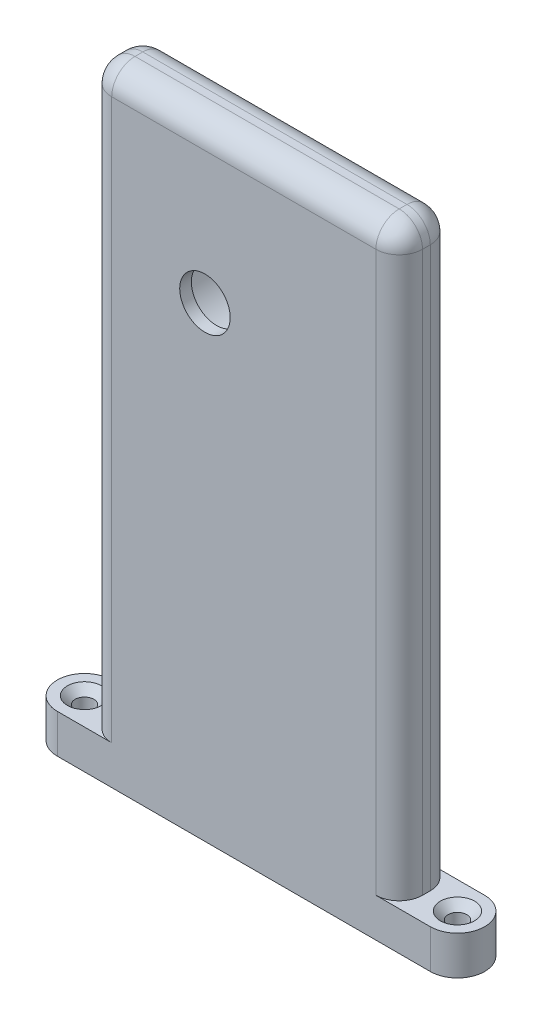
ISO-10303-21;
HEADER;
FILE_DESCRIPTION(('STEP AP214'),'2;1');
FILE_NAME('part.step','',(''),(''),'','','');
FILE_SCHEMA(('AUTOMOTIVE_DESIGN { 1 0 10303 214 1 1 1 1 }'));
ENDSEC;
DATA;
#1=APPLICATION_CONTEXT('core data for automotive mechanical design processes');
#2=APPLICATION_PROTOCOL_DEFINITION('international standard','automotive_design',2000,#1);
#3=PRODUCT_CONTEXT('',#1,'mechanical');
#4=PRODUCT('Part','Part','',(#3));
#5=PRODUCT_RELATED_PRODUCT_CATEGORY('part','',(#4));
#6=PRODUCT_DEFINITION_FORMATION('','',#4);
#7=PRODUCT_DEFINITION_CONTEXT('part definition',#1,'design');
#8=PRODUCT_DEFINITION('design','',#6,#7);
#9=PRODUCT_DEFINITION_SHAPE('','',#8);
#10=(LENGTH_UNIT() NAMED_UNIT(*) SI_UNIT(.MILLI.,.METRE.));
#11=(NAMED_UNIT(*) PLANE_ANGLE_UNIT() SI_UNIT($,.RADIAN.));
#12=(NAMED_UNIT(*) SI_UNIT($,.STERADIAN.) SOLID_ANGLE_UNIT());
#13=UNCERTAINTY_MEASURE_WITH_UNIT(LENGTH_MEASURE(1.E-05),#10,'distance_accuracy_value','');
#14=(GEOMETRIC_REPRESENTATION_CONTEXT(3) GLOBAL_UNCERTAINTY_ASSIGNED_CONTEXT((#13)) GLOBAL_UNIT_ASSIGNED_CONTEXT((#10,
#11,#12)) REPRESENTATION_CONTEXT('',''));
#15=CARTESIAN_POINT('',(0.,0.,0.));
#16=DIRECTION('',(0.,0.,1.));
#17=DIRECTION('',(1.,0.,0.));
#18=AXIS2_PLACEMENT_3D('',#15,#16,#17);
#19=CARTESIAN_POINT('',(20.,0.,7.));
#20=DIRECTION('',(-1.,0.,0.));
#21=DIRECTION('',(0.,0.,1.));
#22=AXIS2_PLACEMENT_3D('',#19,#20,#21);
#23=PLANE('',#22);
#24=DIRECTION('',(0.,0.,1.));
#25=VECTOR('',#24,1.);
#26=CARTESIAN_POINT('',(20.,-35.,7.));
#27=LINE('',#26,#25);
#28=CARTESIAN_POINT('',(20.,-35.,3.));
#29=VERTEX_POINT('',#28);
#30=CARTESIAN_POINT('',(20.,-35.,4.));
#31=VERTEX_POINT('',#30);
#32=EDGE_CURVE('E283',#29,#31,#27,.T.);
#33=ORIENTED_EDGE('',*,*,#32,.F.);
#34=DIRECTION('',(0.,1.,0.));
#35=VECTOR('',#34,1.);
#36=CARTESIAN_POINT('',(20.,0.,3.));
#37=LINE('',#36,#35);
#38=CARTESIAN_POINT('',(20.,37.,3.));
#39=VERTEX_POINT('',#38);
#40=EDGE_CURVE('E185',#29,#39,#37,.T.);
#41=ORIENTED_EDGE('',*,*,#40,.T.);
#42=DIRECTION('',(0.,0.,-1.));
#43=VECTOR('',#42,1.);
#44=CARTESIAN_POINT('',(20.,37.,7.));
#45=LINE('',#44,#43);
#46=CARTESIAN_POINT('',(20.,37.,4.));
#47=VERTEX_POINT('',#46);
#48=EDGE_CURVE('E274',#39,#47,#45,.F.);
#49=ORIENTED_EDGE('',*,*,#48,.T.);
#50=DIRECTION('',(0.,1.,0.));
#51=VECTOR('',#50,1.);
#52=CARTESIAN_POINT('',(20.,-40.,4.));
#53=LINE('',#52,#51);
#54=EDGE_CURVE('E280',#47,#31,#53,.F.);
#55=ORIENTED_EDGE('',*,*,#54,.T.);
#56=EDGE_LOOP('',(#33,#41,#49,#55));
#57=FACE_BOUND('',#56,.T.);
#58=ADVANCED_FACE('F50',(#57),#23,.F.);
#59=CARTESIAN_POINT('',(-20.,0.,7.));
#60=DIRECTION('',(-1.,0.,0.));
#61=DIRECTION('',(0.,0.,1.));
#62=AXIS2_PLACEMENT_3D('',#59,#60,#61);
#63=PLANE('',#62);
#64=DIRECTION('',(0.,1.,0.));
#65=VECTOR('',#64,1.);
#66=CARTESIAN_POINT('',(-20.,-40.,3.));
#67=LINE('',#66,#65);
#68=CARTESIAN_POINT('',(-20.,37.,3.));
#69=VERTEX_POINT('',#68);
#70=CARTESIAN_POINT('',(-20.,-35.,3.));
#71=VERTEX_POINT('',#70);
#72=EDGE_CURVE('E189',#69,#71,#67,.F.);
#73=ORIENTED_EDGE('',*,*,#72,.T.);
#74=DIRECTION('',(0.,0.,1.));
#75=VECTOR('',#74,1.);
#76=CARTESIAN_POINT('',(-20.,-35.,7.));
#77=LINE('',#76,#75);
#78=CARTESIAN_POINT('',(-20.,-35.,4.));
#79=VERTEX_POINT('',#78);
#80=EDGE_CURVE('E62',#71,#79,#77,.T.);
#81=ORIENTED_EDGE('',*,*,#80,.T.);
#82=DIRECTION('',(0.,1.,0.));
#83=VECTOR('',#82,1.);
#84=CARTESIAN_POINT('',(-20.,0.,4.));
#85=LINE('',#84,#83);
#86=CARTESIAN_POINT('',(-20.,37.,4.));
#87=VERTEX_POINT('',#86);
#88=EDGE_CURVE('E170',#79,#87,#85,.T.);
#89=ORIENTED_EDGE('',*,*,#88,.T.);
#90=DIRECTION('',(0.,0.,-1.));
#91=VECTOR('',#90,1.);
#92=CARTESIAN_POINT('',(-20.,37.,7.));
#93=LINE('',#92,#91);
#94=EDGE_CURVE('E179',#87,#69,#93,.T.);
#95=ORIENTED_EDGE('',*,*,#94,.T.);
#96=EDGE_LOOP('',(#73,#81,#89,#95));
#97=FACE_BOUND('',#96,.T.);
#98=ADVANCED_FACE('F377',(#97),#63,.T.);
#99=CARTESIAN_POINT('',(-17.,0.,4.));
#100=DIRECTION('',(0.,1.,0.));
#101=DIRECTION('',(0.,0.,1.));
#102=AXIS2_PLACEMENT_3D('',#99,#100,#101);
#103=CYLINDRICAL_SURFACE('',#102,3.);
#104=ORIENTED_EDGE('',*,*,#88,.F.);
#105=CARTESIAN_POINT('',(-17.,-35.,4.));
#106=DIRECTION('',(0.,-1.,0.));
#107=DIRECTION('',(0.,0.,-1.));
#108=AXIS2_PLACEMENT_3D('',#105,#106,#107);
#109=CIRCLE('',#108,3.);
#110=CARTESIAN_POINT('',(-17.,-35.,7.));
#111=VERTEX_POINT('',#110);
#112=EDGE_CURVE('E151',#79,#111,#109,.F.);
#113=ORIENTED_EDGE('',*,*,#112,.T.);
#114=DIRECTION('',(0.,1.,0.));
#115=VECTOR('',#114,1.);
#116=CARTESIAN_POINT('',(-17.,0.,7.));
#117=LINE('',#116,#115);
#118=CARTESIAN_POINT('',(-17.,37.,7.));
#119=VERTEX_POINT('',#118);
#120=EDGE_CURVE('E164',#119,#111,#117,.F.);
#121=ORIENTED_EDGE('',*,*,#120,.F.);
#122=CARTESIAN_POINT('',(-17.,37.,4.));
#123=DIRECTION('',(0.,1.,0.));
#124=DIRECTION('',(0.,0.,1.));
#125=AXIS2_PLACEMENT_3D('',#122,#123,#124);
#126=CIRCLE('',#125,3.);
#127=EDGE_CURVE('E233',#87,#119,#126,.T.);
#128=ORIENTED_EDGE('',*,*,#127,.F.);
#129=EDGE_LOOP('',(#104,#113,#121,#128));
#130=FACE_BOUND('',#129,.T.);
#131=ADVANCED_FACE('F47',(#130),#103,.T.);
#132=CARTESIAN_POINT('',(17.,0.,4.));
#133=DIRECTION('',(0.,-1.,0.));
#134=DIRECTION('',(0.,0.,-1.));
#135=AXIS2_PLACEMENT_3D('',#132,#133,#134);
#136=CYLINDRICAL_SURFACE('',#135,3.);
#137=DIRECTION('',(0.,1.,0.));
#138=VECTOR('',#137,1.);
#139=CARTESIAN_POINT('',(17.,40.,7.));
#140=LINE('',#139,#138);
#141=CARTESIAN_POINT('',(17.,-35.,7.));
#142=VERTEX_POINT('',#141);
#143=CARTESIAN_POINT('',(17.,37.,7.));
#144=VERTEX_POINT('',#143);
#145=EDGE_CURVE('E176',#142,#144,#140,.T.);
#146=ORIENTED_EDGE('',*,*,#145,.F.);
#147=CARTESIAN_POINT('',(17.,-35.,4.));
#148=DIRECTION('',(0.,-1.,0.));
#149=DIRECTION('',(0.,0.,-1.));
#150=AXIS2_PLACEMENT_3D('',#147,#148,#149);
#151=CIRCLE('',#150,3.);
#152=EDGE_CURVE('E311',#142,#31,#151,.F.);
#153=ORIENTED_EDGE('',*,*,#152,.T.);
#154=ORIENTED_EDGE('',*,*,#54,.F.);
#155=CARTESIAN_POINT('',(17.,37.,4.));
#156=DIRECTION('',(0.,1.,0.));
#157=DIRECTION('',(0.,0.,1.));
#158=AXIS2_PLACEMENT_3D('',#155,#156,#157);
#159=CIRCLE('',#158,3.);
#160=EDGE_CURVE('E227',#144,#47,#159,.T.);
#161=ORIENTED_EDGE('',*,*,#160,.F.);
#162=EDGE_LOOP('',(#146,#153,#154,#161));
#163=FACE_BOUND('',#162,.T.);
#164=ADVANCED_FACE('F307',(#163),#136,.T.);
#165=CARTESIAN_POINT('',(-17.,0.,3.));
#166=DIRECTION('',(0.,-1.,0.));
#167=DIRECTION('',(0.,0.,-1.));
#168=AXIS2_PLACEMENT_3D('',#165,#166,#167);
#169=CYLINDRICAL_SURFACE('',#168,3.);
#170=DIRECTION('',(0.,1.,0.));
#171=VECTOR('',#170,1.);
#172=CARTESIAN_POINT('',(-17.,40.,0.));
#173=LINE('',#172,#171);
#174=CARTESIAN_POINT('',(-17.,-35.,0.));
#175=VERTEX_POINT('',#174);
#176=CARTESIAN_POINT('',(-17.,37.,0.));
#177=VERTEX_POINT('',#176);
#178=EDGE_CURVE('E261',#175,#177,#173,.T.);
#179=ORIENTED_EDGE('',*,*,#178,.F.);
#180=CARTESIAN_POINT('',(-17.,-35.,3.));
#181=DIRECTION('',(0.,-1.,0.));
#182=DIRECTION('',(0.,0.,-1.));
#183=AXIS2_PLACEMENT_3D('',#180,#181,#182);
#184=CIRCLE('',#183,3.);
#185=EDGE_CURVE('E11',#175,#71,#184,.F.);
#186=ORIENTED_EDGE('',*,*,#185,.T.);
#187=ORIENTED_EDGE('',*,*,#72,.F.);
#188=CARTESIAN_POINT('',(-17.,37.,3.));
#189=DIRECTION('',(0.,1.,0.));
#190=DIRECTION('',(0.,0.,1.));
#191=AXIS2_PLACEMENT_3D('',#188,#189,#190);
#192=CIRCLE('',#191,3.);
#193=EDGE_CURVE('E210',#177,#69,#192,.T.);
#194=ORIENTED_EDGE('',*,*,#193,.F.);
#195=EDGE_LOOP('',(#179,#186,#187,#194));
#196=FACE_BOUND('',#195,.T.);
#197=ADVANCED_FACE('F356',(#196),#169,.T.);
#198=CARTESIAN_POINT('',(17.,0.,3.));
#199=DIRECTION('',(0.,1.,0.));
#200=DIRECTION('',(0.,0.,1.));
#201=AXIS2_PLACEMENT_3D('',#198,#199,#200);
#202=CYLINDRICAL_SURFACE('',#201,3.);
#203=ORIENTED_EDGE('',*,*,#40,.F.);
#204=CARTESIAN_POINT('',(17.,-35.,3.));
#205=DIRECTION('',(0.,-1.,0.));
#206=DIRECTION('',(0.,0.,-1.));
#207=AXIS2_PLACEMENT_3D('',#204,#205,#206);
#208=CIRCLE('',#207,3.);
#209=CARTESIAN_POINT('',(17.,-35.,0.));
#210=VERTEX_POINT('',#209);
#211=EDGE_CURVE('E57',#29,#210,#208,.F.);
#212=ORIENTED_EDGE('',*,*,#211,.T.);
#213=DIRECTION('',(0.,1.,0.));
#214=VECTOR('',#213,1.);
#215=CARTESIAN_POINT('',(17.,0.,0.));
#216=LINE('',#215,#214);
#217=CARTESIAN_POINT('',(17.,37.,0.));
#218=VERTEX_POINT('',#217);
#219=EDGE_CURVE('E246',#218,#210,#216,.F.);
#220=ORIENTED_EDGE('',*,*,#219,.F.);
#221=CARTESIAN_POINT('',(17.,37.,3.));
#222=DIRECTION('',(0.,1.,0.));
#223=DIRECTION('',(0.,0.,1.));
#224=AXIS2_PLACEMENT_3D('',#221,#222,#223);
#225=CIRCLE('',#224,3.);
#226=EDGE_CURVE('E201',#39,#218,#225,.T.);
#227=ORIENTED_EDGE('',*,*,#226,.F.);
#228=EDGE_LOOP('',(#203,#212,#220,#227));
#229=FACE_BOUND('',#228,.T.);
#230=ADVANCED_FACE('F242',(#229),#202,.T.);
#231=CARTESIAN_POINT('',(-5.,20.,7.));
#232=DIRECTION('',(0.,0.,-1.));
#233=DIRECTION('',(-1.,0.,0.));
#234=AXIS2_PLACEMENT_3D('',#231,#232,#233);
#235=CYLINDRICAL_SURFACE('',#234,3.25);
#236=CARTESIAN_POINT('',(-5.,20.,7.));
#237=DIRECTION('',(0.,0.,1.));
#238=DIRECTION('',(1.,0.,0.));
#239=AXIS2_PLACEMENT_3D('',#236,#237,#238);
#240=CIRCLE('',#239,3.25);
#241=CARTESIAN_POINT('',(-1.75,20.,7.));
#242=VERTEX_POINT('',#241);
#243=EDGE_CURVE('E338',#242,#242,#240,.T.);
#244=ORIENTED_EDGE('',*,*,#243,.T.);
#245=EDGE_LOOP('',(#244));
#246=FACE_BOUND('',#245,.T.);
#247=CARTESIAN_POINT('',(-5.,20.,5.5));
#248=DIRECTION('',(0.,0.,-1.));
#249=DIRECTION('',(-1.,0.,0.));
#250=AXIS2_PLACEMENT_3D('',#247,#248,#249);
#251=CIRCLE('',#250,3.25);
#252=CARTESIAN_POINT('',(-8.25,20.,5.5));
#253=VERTEX_POINT('',#252);
#254=EDGE_CURVE('E330',#253,#253,#251,.T.);
#255=ORIENTED_EDGE('',*,*,#254,.T.);
#256=EDGE_LOOP('',(#255));
#257=FACE_BOUND('',#256,.T.);
#258=ADVANCED_FACE('F391',(#246,#257),#235,.F.);
#259=CARTESIAN_POINT('',(0.,-40.,7.));
#260=DIRECTION('',(0.,1.,0.));
#261=DIRECTION('',(0.,0.,1.));
#262=AXIS2_PLACEMENT_3D('',#259,#260,#261);
#263=PLANE('',#262);
#264=CARTESIAN_POINT('',(24.,-40.,3.5));
#265=DIRECTION('',(0.,-1.,0.));
#266=DIRECTION('',(0.,0.,-1.));
#267=AXIS2_PLACEMENT_3D('',#264,#265,#266);
#268=CIRCLE('',#267,1.2);
#269=CARTESIAN_POINT('',(24.,-40.,2.3));
#270=VERTEX_POINT('',#269);
#271=EDGE_CURVE('E669',#270,#270,#268,.T.);
#272=ORIENTED_EDGE('',*,*,#271,.F.);
#273=EDGE_LOOP('',(#272));
#274=FACE_BOUND('',#273,.T.);
#275=CARTESIAN_POINT('',(-24.,-40.,3.5));
#276=DIRECTION('',(0.,-1.,0.));
#277=DIRECTION('',(0.,0.,-1.));
#278=AXIS2_PLACEMENT_3D('',#275,#276,#277);
#279=CIRCLE('',#278,1.2);
#280=CARTESIAN_POINT('',(-24.,-40.,2.3));
#281=VERTEX_POINT('',#280);
#282=EDGE_CURVE('E727',#281,#281,#279,.T.);
#283=ORIENTED_EDGE('',*,*,#282,.F.);
#284=EDGE_LOOP('',(#283));
#285=FACE_BOUND('',#284,.T.);
#286=CARTESIAN_POINT('',(-24.,-40.,3.5));
#287=DIRECTION('',(0.,-1.,0.));
#288=DIRECTION('',(0.,0.,-1.));
#289=AXIS2_PLACEMENT_3D('',#286,#287,#288);
#290=CIRCLE('',#289,3.5);
#291=CARTESIAN_POINT('',(-24.,-40.,7.));
#292=VERTEX_POINT('',#291);
#293=CARTESIAN_POINT('',(-24.,-40.,0.));
#294=VERTEX_POINT('',#293);
#295=EDGE_CURVE('E157',#292,#294,#290,.T.);
#296=ORIENTED_EDGE('',*,*,#295,.T.);
#297=DIRECTION('',(1.,0.,0.));
#298=VECTOR('',#297,1.);
#299=CARTESIAN_POINT('',(0.,-40.,0.));
#300=LINE('',#299,#298);
#301=CARTESIAN_POINT('',(24.,-40.,0.));
#302=VERTEX_POINT('',#301);
#303=EDGE_CURVE('E334',#294,#302,#300,.T.);
#304=ORIENTED_EDGE('',*,*,#303,.T.);
#305=CARTESIAN_POINT('',(24.,-40.,3.5));
#306=DIRECTION('',(0.,-1.,0.));
#307=DIRECTION('',(0.,0.,-1.));
#308=AXIS2_PLACEMENT_3D('',#305,#306,#307);
#309=CIRCLE('',#308,3.5);
#310=CARTESIAN_POINT('',(24.,-40.,7.));
#311=VERTEX_POINT('',#310);
#312=EDGE_CURVE('E697',#302,#311,#309,.T.);
#313=ORIENTED_EDGE('',*,*,#312,.T.);
#314=DIRECTION('',(1.,0.,0.));
#315=VECTOR('',#314,1.);
#316=CARTESIAN_POINT('',(0.,-40.,7.));
#317=LINE('',#316,#315);
#318=EDGE_CURVE('E343',#292,#311,#317,.T.);
#319=ORIENTED_EDGE('',*,*,#318,.F.);
#320=EDGE_LOOP('',(#296,#304,#313,#319));
#321=FACE_BOUND('',#320,.T.);
#322=ADVANCED_FACE('F387',(#274,#285,#321),#263,.F.);
#323=CARTESIAN_POINT('',(0.,40.,7.));
#324=DIRECTION('',(0.,1.,0.));
#325=DIRECTION('',(0.,0.,1.));
#326=AXIS2_PLACEMENT_3D('',#323,#324,#325);
#327=PLANE('',#326);
#328=DIRECTION('',(1.,0.,0.));
#329=VECTOR('',#328,1.);
#330=CARTESIAN_POINT('',(-20.,40.,3.));
#331=LINE('',#330,#329);
#332=CARTESIAN_POINT('',(17.,40.,3.));
#333=VERTEX_POINT('',#332);
#334=CARTESIAN_POINT('',(-17.,40.,3.));
#335=VERTEX_POINT('',#334);
#336=EDGE_CURVE('E270',#333,#335,#331,.F.);
#337=ORIENTED_EDGE('',*,*,#336,.T.);
#338=DIRECTION('',(0.,0.,-1.));
#339=VECTOR('',#338,1.);
#340=CARTESIAN_POINT('',(-17.,40.,7.));
#341=LINE('',#340,#339);
#342=CARTESIAN_POINT('',(-17.,40.,4.));
#343=VERTEX_POINT('',#342);
#344=EDGE_CURVE('E272',#335,#343,#341,.F.);
#345=ORIENTED_EDGE('',*,*,#344,.T.);
#346=DIRECTION('',(1.,0.,0.));
#347=VECTOR('',#346,1.);
#348=CARTESIAN_POINT('',(0.,40.,4.));
#349=LINE('',#348,#347);
#350=CARTESIAN_POINT('',(17.,40.,4.));
#351=VERTEX_POINT('',#350);
#352=EDGE_CURVE('E258',#343,#351,#349,.T.);
#353=ORIENTED_EDGE('',*,*,#352,.T.);
#354=DIRECTION('',(0.,0.,-1.));
#355=VECTOR('',#354,1.);
#356=CARTESIAN_POINT('',(17.,40.,0.));
#357=LINE('',#356,#355);
#358=EDGE_CURVE('E253',#351,#333,#357,.T.);
#359=ORIENTED_EDGE('',*,*,#358,.T.);
#360=EDGE_LOOP('',(#337,#345,#353,#359));
#361=FACE_BOUND('',#360,.T.);
#362=ADVANCED_FACE('F296',(#361),#327,.T.);
#363=CARTESIAN_POINT('',(0.,0.,7.));
#364=DIRECTION('',(0.,0.,1.));
#365=DIRECTION('',(1.,0.,0.));
#366=AXIS2_PLACEMENT_3D('',#363,#364,#365);
#367=PLANE('',#366);
#368=ORIENTED_EDGE('',*,*,#318,.T.);
#369=DIRECTION('',(0.,-1.,0.));
#370=VECTOR('',#369,1.);
#371=CARTESIAN_POINT('',(24.,-35.,7.));
#372=LINE('',#371,#370);
#373=CARTESIAN_POINT('',(24.,-35.,7.));
#374=VERTEX_POINT('',#373);
#375=EDGE_CURVE('E689',#374,#311,#372,.T.);
#376=ORIENTED_EDGE('',*,*,#375,.F.);
#377=DIRECTION('',(-1.,0.,0.));
#378=VECTOR('',#377,1.);
#379=CARTESIAN_POINT('',(17.,-35.,7.));
#380=LINE('',#379,#378);
#381=EDGE_CURVE('E709',#374,#142,#380,.T.);
#382=ORIENTED_EDGE('',*,*,#381,.T.);
#383=ORIENTED_EDGE('',*,*,#145,.T.);
#384=DIRECTION('',(1.,0.,0.));
#385=VECTOR('',#384,1.);
#386=CARTESIAN_POINT('',(0.,37.,7.));
#387=LINE('',#386,#385);
#388=EDGE_CURVE('E172',#144,#119,#387,.F.);
#389=ORIENTED_EDGE('',*,*,#388,.T.);
#390=ORIENTED_EDGE('',*,*,#120,.T.);
#391=DIRECTION('',(-1.,0.,0.));
#392=VECTOR('',#391,1.);
#393=CARTESIAN_POINT('',(-17.,-35.,7.));
#394=LINE('',#393,#392);
#395=CARTESIAN_POINT('',(-24.,-35.,7.));
#396=VERTEX_POINT('',#395);
#397=EDGE_CURVE('E147',#111,#396,#394,.T.);
#398=ORIENTED_EDGE('',*,*,#397,.T.);
#399=DIRECTION('',(0.,-1.,0.));
#400=VECTOR('',#399,1.);
#401=CARTESIAN_POINT('',(-24.,-35.,7.));
#402=LINE('',#401,#400);
#403=EDGE_CURVE('E694',#396,#292,#402,.T.);
#404=ORIENTED_EDGE('',*,*,#403,.T.);
#405=EDGE_LOOP('',(#368,#376,#382,#383,#389,#390,#398,#404));
#406=FACE_BOUND('',#405,.T.);
#407=ORIENTED_EDGE('',*,*,#243,.F.);
#408=EDGE_LOOP('',(#407));
#409=FACE_BOUND('',#408,.T.);
#410=ADVANCED_FACE('F171',(#406,#409),#367,.T.);
#411=CARTESIAN_POINT('',(0.,0.,0.));
#412=DIRECTION('',(0.,0.,1.));
#413=DIRECTION('',(1.,0.,0.));
#414=AXIS2_PLACEMENT_3D('',#411,#412,#413);
#415=PLANE('',#414);
#416=CARTESIAN_POINT('',(-5.,20.,0.));
#417=DIRECTION('',(0.,0.,-1.));
#418=DIRECTION('',(-1.,0.,0.));
#419=AXIS2_PLACEMENT_3D('',#416,#417,#418);
#420=CIRCLE('',#419,6.5);
#421=CARTESIAN_POINT('',(-11.5,20.,0.));
#422=VERTEX_POINT('',#421);
#423=EDGE_CURVE('E337',#422,#422,#420,.T.);
#424=ORIENTED_EDGE('',*,*,#423,.F.);
#425=EDGE_LOOP('',(#424));
#426=FACE_BOUND('',#425,.T.);
#427=DIRECTION('',(1.,0.,0.));
#428=VECTOR('',#427,1.);
#429=CARTESIAN_POINT('',(20.,37.,0.));
#430=LINE('',#429,#428);
#431=EDGE_CURVE('E254',#177,#218,#430,.T.);
#432=ORIENTED_EDGE('',*,*,#431,.T.);
#433=ORIENTED_EDGE('',*,*,#219,.T.);
#434=DIRECTION('',(1.,0.,0.));
#435=VECTOR('',#434,1.);
#436=CARTESIAN_POINT('',(17.,-35.,0.));
#437=LINE('',#436,#435);
#438=CARTESIAN_POINT('',(24.,-35.,0.));
#439=VERTEX_POINT('',#438);
#440=EDGE_CURVE('E69',#210,#439,#437,.T.);
#441=ORIENTED_EDGE('',*,*,#440,.T.);
#442=DIRECTION('',(0.,-1.,0.));
#443=VECTOR('',#442,1.);
#444=CARTESIAN_POINT('',(24.,-35.,0.));
#445=LINE('',#444,#443);
#446=EDGE_CURVE('E704',#439,#302,#445,.T.);
#447=ORIENTED_EDGE('',*,*,#446,.T.);
#448=ORIENTED_EDGE('',*,*,#303,.F.);
#449=DIRECTION('',(0.,-1.,0.));
#450=VECTOR('',#449,1.);
#451=CARTESIAN_POINT('',(-24.,-35.,0.));
#452=LINE('',#451,#450);
#453=CARTESIAN_POINT('',(-24.,-35.,0.));
#454=VERTEX_POINT('',#453);
#455=EDGE_CURVE('E316',#454,#294,#452,.T.);
#456=ORIENTED_EDGE('',*,*,#455,.F.);
#457=DIRECTION('',(1.,0.,0.));
#458=VECTOR('',#457,1.);
#459=CARTESIAN_POINT('',(-17.,-35.,0.));
#460=LINE('',#459,#458);
#461=EDGE_CURVE('E354',#454,#175,#460,.T.);
#462=ORIENTED_EDGE('',*,*,#461,.T.);
#463=ORIENTED_EDGE('',*,*,#178,.T.);
#464=EDGE_LOOP('',(#432,#433,#441,#447,#448,#456,#462,#463));
#465=FACE_BOUND('',#464,.T.);
#466=ADVANCED_FACE('F249',(#426,#465),#415,.F.);
#467=CARTESIAN_POINT('',(-5.,20.,5.));
#468=DIRECTION('',(0.,0.,-1.));
#469=DIRECTION('',(-1.,0.,0.));
#470=AXIS2_PLACEMENT_3D('',#467,#468,#469);
#471=CYLINDRICAL_SURFACE('',#470,6.5);
#472=CARTESIAN_POINT('',(-5.,20.,5.));
#473=DIRECTION('',(0.,0.,-1.));
#474=DIRECTION('',(-1.,0.,0.));
#475=AXIS2_PLACEMENT_3D('',#472,#473,#474);
#476=CIRCLE('',#475,6.5);
#477=CARTESIAN_POINT('',(-11.5,20.,5.));
#478=VERTEX_POINT('',#477);
#479=EDGE_CURVE('E333',#478,#478,#476,.T.);
#480=ORIENTED_EDGE('',*,*,#479,.F.);
#481=EDGE_LOOP('',(#480));
#482=FACE_BOUND('',#481,.T.);
#483=ORIENTED_EDGE('',*,*,#423,.T.);
#484=EDGE_LOOP('',(#483));
#485=FACE_BOUND('',#484,.T.);
#486=ADVANCED_FACE('F505',(#482,#485),#471,.F.);
#487=CARTESIAN_POINT('',(-5.,20.,5.));
#488=DIRECTION('',(0.,0.,-1.));
#489=DIRECTION('',(-1.,0.,0.));
#490=AXIS2_PLACEMENT_3D('',#487,#488,#489);
#491=PLANE('',#490);
#492=CARTESIAN_POINT('',(-5.,20.,5.));
#493=DIRECTION('',(0.,0.,-1.));
#494=DIRECTION('',(-1.,0.,0.));
#495=AXIS2_PLACEMENT_3D('',#492,#493,#494);
#496=CIRCLE('',#495,6.);
#497=CARTESIAN_POINT('',(-11.,20.,5.));
#498=VERTEX_POINT('',#497);
#499=EDGE_CURVE('E238',#498,#498,#496,.T.);
#500=ORIENTED_EDGE('',*,*,#499,.F.);
#501=EDGE_LOOP('',(#500));
#502=FACE_BOUND('',#501,.T.);
#503=ORIENTED_EDGE('',*,*,#479,.T.);
#504=EDGE_LOOP('',(#503));
#505=FACE_BOUND('',#504,.T.);
#506=ADVANCED_FACE('F597',(#502,#505),#491,.T.);
#507=CARTESIAN_POINT('',(-5.,20.,5.5));
#508=DIRECTION('',(0.,0.,-1.));
#509=DIRECTION('',(-1.,0.,0.));
#510=AXIS2_PLACEMENT_3D('',#507,#508,#509);
#511=CYLINDRICAL_SURFACE('',#510,6.);
#512=CARTESIAN_POINT('',(-5.,20.,5.5));
#513=DIRECTION('',(0.,0.,-1.));
#514=DIRECTION('',(-1.,0.,0.));
#515=AXIS2_PLACEMENT_3D('',#512,#513,#514);
#516=CIRCLE('',#515,6.);
#517=CARTESIAN_POINT('',(-11.,20.,5.5));
#518=VERTEX_POINT('',#517);
#519=EDGE_CURVE('E322',#518,#518,#516,.T.);
#520=ORIENTED_EDGE('',*,*,#519,.F.);
#521=EDGE_LOOP('',(#520));
#522=FACE_BOUND('',#521,.T.);
#523=ORIENTED_EDGE('',*,*,#499,.T.);
#524=EDGE_LOOP('',(#523));
#525=FACE_BOUND('',#524,.T.);
#526=ADVANCED_FACE('F595',(#522,#525),#511,.F.);
#527=CARTESIAN_POINT('',(-5.,20.,5.5));
#528=DIRECTION('',(0.,0.,-1.));
#529=DIRECTION('',(-1.,0.,0.));
#530=AXIS2_PLACEMENT_3D('',#527,#528,#529);
#531=PLANE('',#530);
#532=ORIENTED_EDGE('',*,*,#254,.F.);
#533=EDGE_LOOP('',(#532));
#534=FACE_BOUND('',#533,.T.);
#535=ORIENTED_EDGE('',*,*,#519,.T.);
#536=EDGE_LOOP('',(#535));
#537=FACE_BOUND('',#536,.T.);
#538=ADVANCED_FACE('F374',(#534,#537),#531,.T.);
#539=CARTESIAN_POINT('',(0.,37.,4.));
#540=DIRECTION('',(1.,0.,0.));
#541=DIRECTION('',(0.,0.,-1.));
#542=AXIS2_PLACEMENT_3D('',#539,#540,#541);
#543=CYLINDRICAL_SURFACE('',#542,3.);
#544=CARTESIAN_POINT('',(-17.,37.,4.));
#545=DIRECTION('',(-1.,0.,0.));
#546=DIRECTION('',(0.,0.,1.));
#547=AXIS2_PLACEMENT_3D('',#544,#545,#546);
#548=CIRCLE('',#547,3.);
#549=EDGE_CURVE('E232',#119,#343,#548,.T.);
#550=ORIENTED_EDGE('',*,*,#549,.F.);
#551=ORIENTED_EDGE('',*,*,#388,.F.);
#552=CARTESIAN_POINT('',(17.,37.,4.));
#553=DIRECTION('',(1.,0.,0.));
#554=DIRECTION('',(0.,0.,-1.));
#555=AXIS2_PLACEMENT_3D('',#552,#553,#554);
#556=CIRCLE('',#555,3.);
#557=EDGE_CURVE('E221',#351,#144,#556,.T.);
#558=ORIENTED_EDGE('',*,*,#557,.F.);
#559=ORIENTED_EDGE('',*,*,#352,.F.);
#560=EDGE_LOOP('',(#550,#551,#558,#559));
#561=FACE_BOUND('',#560,.T.);
#562=ADVANCED_FACE('F303',(#561),#543,.T.);
#563=CARTESIAN_POINT('',(-17.,37.,4.));
#564=DIRECTION('',(0.,0.,1.));
#565=DIRECTION('',(1.,0.,0.));
#566=AXIS2_PLACEMENT_3D('',#563,#564,#565);
#567=SPHERICAL_SURFACE('',#566,3.);
#568=ORIENTED_EDGE('',*,*,#127,.T.);
#569=ORIENTED_EDGE('',*,*,#549,.T.);
#570=CARTESIAN_POINT('',(-17.,37.,4.));
#571=DIRECTION('',(0.,0.,1.));
#572=DIRECTION('',(1.,0.,0.));
#573=AXIS2_PLACEMENT_3D('',#570,#571,#572);
#574=CIRCLE('',#573,3.);
#575=EDGE_CURVE('E218',#87,#343,#574,.F.);
#576=ORIENTED_EDGE('',*,*,#575,.F.);
#577=EDGE_LOOP('',(#568,#569,#576));
#578=FACE_BOUND('',#577,.T.);
#579=ADVANCED_FACE('F370',(#578),#567,.T.);
#580=CARTESIAN_POINT('',(17.,37.,4.));
#581=DIRECTION('',(0.,0.,1.));
#582=DIRECTION('',(1.,0.,0.));
#583=AXIS2_PLACEMENT_3D('',#580,#581,#582);
#584=SPHERICAL_SURFACE('',#583,3.);
#585=ORIENTED_EDGE('',*,*,#557,.T.);
#586=ORIENTED_EDGE('',*,*,#160,.T.);
#587=CARTESIAN_POINT('',(17.,37.,4.));
#588=DIRECTION('',(0.,0.,1.));
#589=DIRECTION('',(1.,0.,0.));
#590=AXIS2_PLACEMENT_3D('',#587,#588,#589);
#591=CIRCLE('',#590,3.);
#592=EDGE_CURVE('E214',#351,#47,#591,.F.);
#593=ORIENTED_EDGE('',*,*,#592,.F.);
#594=EDGE_LOOP('',(#585,#586,#593));
#595=FACE_BOUND('',#594,.T.);
#596=ADVANCED_FACE('F306',(#595),#584,.T.);
#597=CARTESIAN_POINT('',(-17.,37.,7.));
#598=DIRECTION('',(0.,0.,-1.));
#599=DIRECTION('',(-1.,0.,0.));
#600=AXIS2_PLACEMENT_3D('',#597,#598,#599);
#601=CYLINDRICAL_SURFACE('',#600,3.);
#602=ORIENTED_EDGE('',*,*,#575,.T.);
#603=ORIENTED_EDGE('',*,*,#344,.F.);
#604=CARTESIAN_POINT('',(-17.,37.,3.));
#605=DIRECTION('',(0.,0.,-1.));
#606=DIRECTION('',(-1.,0.,0.));
#607=AXIS2_PLACEMENT_3D('',#604,#605,#606);
#608=CIRCLE('',#607,3.);
#609=EDGE_CURVE('E211',#69,#335,#608,.T.);
#610=ORIENTED_EDGE('',*,*,#609,.F.);
#611=ORIENTED_EDGE('',*,*,#94,.F.);
#612=EDGE_LOOP('',(#602,#603,#610,#611));
#613=FACE_BOUND('',#612,.T.);
#614=ADVANCED_FACE('F364',(#613),#601,.T.);
#615=CARTESIAN_POINT('',(17.,37.,7.));
#616=DIRECTION('',(0.,0.,1.));
#617=DIRECTION('',(1.,0.,0.));
#618=AXIS2_PLACEMENT_3D('',#615,#616,#617);
#619=CYLINDRICAL_SURFACE('',#618,3.);
#620=ORIENTED_EDGE('',*,*,#592,.T.);
#621=ORIENTED_EDGE('',*,*,#48,.F.);
#622=CARTESIAN_POINT('',(17.,37.,3.));
#623=DIRECTION('',(0.,0.,-1.));
#624=DIRECTION('',(-1.,0.,0.));
#625=AXIS2_PLACEMENT_3D('',#622,#623,#624);
#626=CIRCLE('',#625,3.);
#627=EDGE_CURVE('E198',#333,#39,#626,.T.);
#628=ORIENTED_EDGE('',*,*,#627,.F.);
#629=ORIENTED_EDGE('',*,*,#358,.F.);
#630=EDGE_LOOP('',(#620,#621,#628,#629));
#631=FACE_BOUND('',#630,.T.);
#632=ADVANCED_FACE('F290',(#631),#619,.T.);
#633=CARTESIAN_POINT('',(-17.,37.,3.));
#634=DIRECTION('',(-1.,0.,0.));
#635=DIRECTION('',(0.,0.,1.));
#636=AXIS2_PLACEMENT_3D('',#633,#634,#635);
#637=SPHERICAL_SURFACE('',#636,3.);
#638=ORIENTED_EDGE('',*,*,#193,.T.);
#639=ORIENTED_EDGE('',*,*,#609,.T.);
#640=CARTESIAN_POINT('',(-17.,37.,3.));
#641=DIRECTION('',(-1.,0.,0.));
#642=DIRECTION('',(0.,0.,1.));
#643=AXIS2_PLACEMENT_3D('',#640,#641,#642);
#644=CIRCLE('',#643,3.);
#645=EDGE_CURVE('E196',#177,#335,#644,.F.);
#646=ORIENTED_EDGE('',*,*,#645,.F.);
#647=EDGE_LOOP('',(#638,#639,#646));
#648=FACE_BOUND('',#647,.T.);
#649=ADVANCED_FACE('F363',(#648),#637,.T.);
#650=CARTESIAN_POINT('',(17.,37.,3.));
#651=DIRECTION('',(1.,0.,0.));
#652=DIRECTION('',(0.,0.,-1.));
#653=AXIS2_PLACEMENT_3D('',#650,#651,#652);
#654=SPHERICAL_SURFACE('',#653,3.);
#655=ORIENTED_EDGE('',*,*,#627,.T.);
#656=ORIENTED_EDGE('',*,*,#226,.T.);
#657=CARTESIAN_POINT('',(17.,37.,3.));
#658=DIRECTION('',(1.,0.,0.));
#659=DIRECTION('',(0.,0.,-1.));
#660=AXIS2_PLACEMENT_3D('',#657,#658,#659);
#661=CIRCLE('',#660,3.);
#662=EDGE_CURVE('E169',#333,#218,#661,.F.);
#663=ORIENTED_EDGE('',*,*,#662,.F.);
#664=EDGE_LOOP('',(#655,#656,#663));
#665=FACE_BOUND('',#664,.T.);
#666=ADVANCED_FACE('F291',(#665),#654,.T.);
#667=CARTESIAN_POINT('',(0.,37.,3.));
#668=DIRECTION('',(-1.,0.,0.));
#669=DIRECTION('',(0.,0.,1.));
#670=AXIS2_PLACEMENT_3D('',#667,#668,#669);
#671=CYLINDRICAL_SURFACE('',#670,3.);
#672=ORIENTED_EDGE('',*,*,#645,.T.);
#673=ORIENTED_EDGE('',*,*,#336,.F.);
#674=ORIENTED_EDGE('',*,*,#662,.T.);
#675=ORIENTED_EDGE('',*,*,#431,.F.);
#676=EDGE_LOOP('',(#672,#673,#674,#675));
#677=FACE_BOUND('',#676,.T.);
#678=ADVANCED_FACE('F294',(#677),#671,.T.);
#679=CARTESIAN_POINT('',(24.,-35.,3.5));
#680=DIRECTION('',(0.,-1.,0.));
#681=DIRECTION('',(0.,0.,-1.));
#682=AXIS2_PLACEMENT_3D('',#679,#680,#681);
#683=CYLINDRICAL_SURFACE('',#682,3.5);
#684=ORIENTED_EDGE('',*,*,#312,.F.);
#685=ORIENTED_EDGE('',*,*,#446,.F.);
#686=CARTESIAN_POINT('',(24.,-35.,3.5));
#687=DIRECTION('',(0.,-1.,0.));
#688=DIRECTION('',(0.,0.,-1.));
#689=AXIS2_PLACEMENT_3D('',#686,#687,#688);
#690=CIRCLE('',#689,3.5);
#691=EDGE_CURVE('E720',#439,#374,#690,.T.);
#692=ORIENTED_EDGE('',*,*,#691,.T.);
#693=ORIENTED_EDGE('',*,*,#375,.T.);
#694=EDGE_LOOP('',(#684,#685,#692,#693));
#695=FACE_BOUND('',#694,.T.);
#696=ADVANCED_FACE('F400',(#695),#683,.T.);
#697=CARTESIAN_POINT('',(24.,-35.,3.5));
#698=DIRECTION('',(0.,-1.,0.));
#699=DIRECTION('',(0.,0.,-1.));
#700=AXIS2_PLACEMENT_3D('',#697,#698,#699);
#701=PLANE('',#700);
#702=CARTESIAN_POINT('',(24.,-35.,3.5));
#703=DIRECTION('',(0.,1.,0.));
#704=DIRECTION('',(0.,0.,1.));
#705=AXIS2_PLACEMENT_3D('',#702,#703,#704);
#706=CIRCLE('',#705,2.2);
#707=CARTESIAN_POINT('',(24.,-35.,5.7));
#708=VERTEX_POINT('',#707);
#709=EDGE_CURVE('E683',#708,#708,#706,.T.);
#710=ORIENTED_EDGE('',*,*,#709,.F.);
#711=EDGE_LOOP('',(#710));
#712=FACE_BOUND('',#711,.T.);
#713=ORIENTED_EDGE('',*,*,#152,.F.);
#714=ORIENTED_EDGE('',*,*,#381,.F.);
#715=ORIENTED_EDGE('',*,*,#691,.F.);
#716=ORIENTED_EDGE('',*,*,#440,.F.);
#717=ORIENTED_EDGE('',*,*,#211,.F.);
#718=ORIENTED_EDGE('',*,*,#32,.T.);
#719=EDGE_LOOP('',(#713,#714,#715,#716,#717,#718));
#720=FACE_BOUND('',#719,.T.);
#721=ADVANCED_FACE('F520',(#712,#720),#701,.F.);
#722=CARTESIAN_POINT('',(-24.,-35.,3.5));
#723=DIRECTION('',(0.,-1.,0.));
#724=DIRECTION('',(0.,0.,-1.));
#725=AXIS2_PLACEMENT_3D('',#722,#723,#724);
#726=CYLINDRICAL_SURFACE('',#725,3.5);
#727=ORIENTED_EDGE('',*,*,#295,.F.);
#728=ORIENTED_EDGE('',*,*,#403,.F.);
#729=CARTESIAN_POINT('',(-24.,-35.,3.5));
#730=DIRECTION('',(0.,-1.,0.));
#731=DIRECTION('',(0.,0.,-1.));
#732=AXIS2_PLACEMENT_3D('',#729,#730,#731);
#733=CIRCLE('',#732,3.5);
#734=EDGE_CURVE('E153',#396,#454,#733,.T.);
#735=ORIENTED_EDGE('',*,*,#734,.T.);
#736=ORIENTED_EDGE('',*,*,#455,.T.);
#737=EDGE_LOOP('',(#727,#728,#735,#736));
#738=FACE_BOUND('',#737,.T.);
#739=ADVANCED_FACE('F526',(#738),#726,.T.);
#740=CARTESIAN_POINT('',(-24.,-35.,3.5));
#741=DIRECTION('',(0.,-1.,0.));
#742=DIRECTION('',(0.,0.,-1.));
#743=AXIS2_PLACEMENT_3D('',#740,#741,#742);
#744=PLANE('',#743);
#745=CARTESIAN_POINT('',(-24.,-35.,3.5));
#746=DIRECTION('',(0.,1.,0.));
#747=DIRECTION('',(0.,0.,1.));
#748=AXIS2_PLACEMENT_3D('',#745,#746,#747);
#749=CIRCLE('',#748,2.2);
#750=CARTESIAN_POINT('',(-24.,-35.,5.7));
#751=VERTEX_POINT('',#750);
#752=EDGE_CURVE('E674',#751,#751,#749,.T.);
#753=ORIENTED_EDGE('',*,*,#752,.F.);
#754=EDGE_LOOP('',(#753));
#755=FACE_BOUND('',#754,.T.);
#756=ORIENTED_EDGE('',*,*,#112,.F.);
#757=ORIENTED_EDGE('',*,*,#80,.F.);
#758=ORIENTED_EDGE('',*,*,#185,.F.);
#759=ORIENTED_EDGE('',*,*,#461,.F.);
#760=ORIENTED_EDGE('',*,*,#734,.F.);
#761=ORIENTED_EDGE('',*,*,#397,.F.);
#762=EDGE_LOOP('',(#756,#757,#758,#759,#760,#761));
#763=FACE_BOUND('',#762,.T.);
#764=ADVANCED_FACE('F149',(#755,#763),#744,.F.);
#765=CARTESIAN_POINT('',(24.,-35.,3.5));
#766=DIRECTION('',(0.,1.,0.));
#767=DIRECTION('',(0.,0.,1.));
#768=AXIS2_PLACEMENT_3D('',#765,#766,#767);
#769=CONICAL_SURFACE('',#768,2.2,0.785398163397448);
#770=CARTESIAN_POINT('',(24.,-36.,3.5));
#771=DIRECTION('',(0.,-1.,0.));
#772=DIRECTION('',(0.,0.,-1.));
#773=AXIS2_PLACEMENT_3D('',#770,#771,#772);
#774=CIRCLE('',#773,1.2);
#775=CARTESIAN_POINT('',(24.,-36.,2.3));
#776=VERTEX_POINT('',#775);
#777=EDGE_CURVE('E672',#776,#776,#774,.F.);
#778=ORIENTED_EDGE('',*,*,#777,.F.);
#779=EDGE_LOOP('',(#778));
#780=FACE_BOUND('',#779,.T.);
#781=ORIENTED_EDGE('',*,*,#709,.T.);
#782=EDGE_LOOP('',(#781));
#783=FACE_BOUND('',#782,.T.);
#784=ADVANCED_FACE('F548',(#780,#783),#769,.F.);
#785=CARTESIAN_POINT('',(-24.,-35.,3.5));
#786=DIRECTION('',(0.,1.,0.));
#787=DIRECTION('',(0.,0.,1.));
#788=AXIS2_PLACEMENT_3D('',#785,#786,#787);
#789=CONICAL_SURFACE('',#788,2.2,0.785398163397448);
#790=CARTESIAN_POINT('',(-24.,-36.,3.5));
#791=DIRECTION('',(0.,-1.,0.));
#792=DIRECTION('',(0.,0.,-1.));
#793=AXIS2_PLACEMENT_3D('',#790,#791,#792);
#794=CIRCLE('',#793,1.2);
#795=CARTESIAN_POINT('',(-24.,-36.,2.3));
#796=VERTEX_POINT('',#795);
#797=EDGE_CURVE('E678',#796,#796,#794,.F.);
#798=ORIENTED_EDGE('',*,*,#797,.F.);
#799=EDGE_LOOP('',(#798));
#800=FACE_BOUND('',#799,.T.);
#801=ORIENTED_EDGE('',*,*,#752,.T.);
#802=EDGE_LOOP('',(#801));
#803=FACE_BOUND('',#802,.T.);
#804=ADVANCED_FACE('F558',(#800,#803),#789,.F.);
#805=CARTESIAN_POINT('',(-24.,-40.,3.5));
#806=DIRECTION('',(0.,1.,0.));
#807=DIRECTION('',(0.,0.,1.));
#808=AXIS2_PLACEMENT_3D('',#805,#806,#807);
#809=CYLINDRICAL_SURFACE('',#808,1.2);
#810=ORIENTED_EDGE('',*,*,#282,.T.);
#811=EDGE_LOOP('',(#810));
#812=FACE_BOUND('',#811,.T.);
#813=ORIENTED_EDGE('',*,*,#797,.T.);
#814=EDGE_LOOP('',(#813));
#815=FACE_BOUND('',#814,.T.);
#816=ADVANCED_FACE('F564',(#812,#815),#809,.F.);
#817=CARTESIAN_POINT('',(24.,-40.,3.5));
#818=DIRECTION('',(0.,1.,0.));
#819=DIRECTION('',(0.,0.,1.));
#820=AXIS2_PLACEMENT_3D('',#817,#818,#819);
#821=CYLINDRICAL_SURFACE('',#820,1.2);
#822=ORIENTED_EDGE('',*,*,#271,.T.);
#823=EDGE_LOOP('',(#822));
#824=FACE_BOUND('',#823,.T.);
#825=ORIENTED_EDGE('',*,*,#777,.T.);
#826=EDGE_LOOP('',(#825));
#827=FACE_BOUND('',#826,.T.);
#828=ADVANCED_FACE('F573',(#824,#827),#821,.F.);
#829=CLOSED_SHELL('',(#58,#98,#131,#164,#197,#230,#258,#322,#362,#410,#466,#486,#506,#526,#538,
#562,#579,#596,#614,#632,#649,#666,#678,#696,#721,#739,#764,#784,#804,#816,#828));
#830=MANIFOLD_SOLID_BREP('B2',#829);
#831=ADVANCED_BREP_SHAPE_REPRESENTATION('',(#18,#830),#14);
#832=SHAPE_DEFINITION_REPRESENTATION(#9,#831);
ENDSEC;
END-ISO-10303-21;
